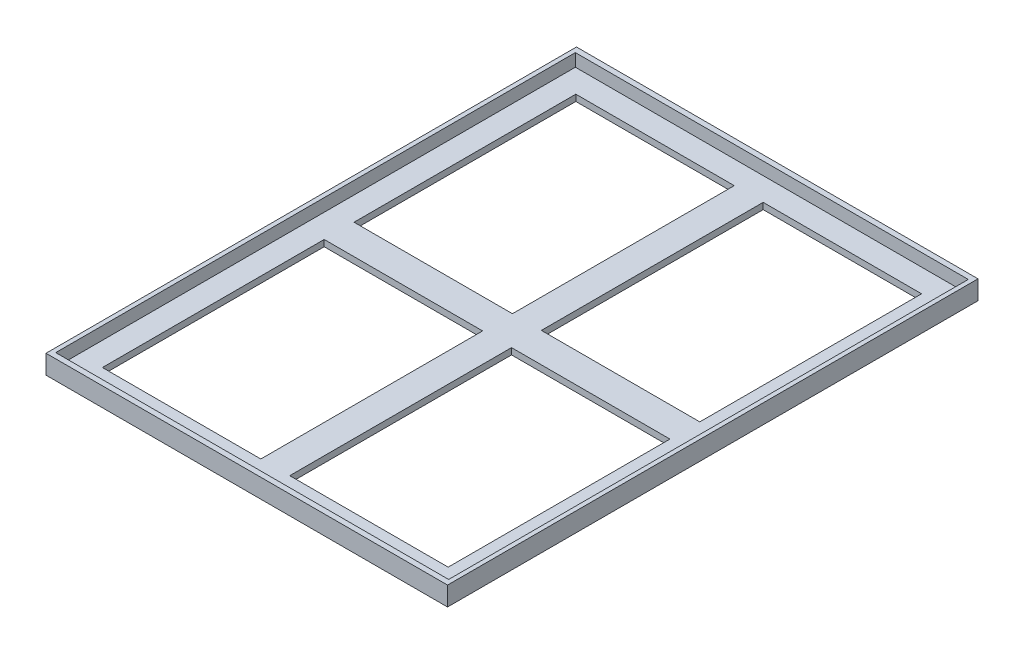
ISO-10303-21;
HEADER;
FILE_DESCRIPTION(('STEP AP214'),'2;1');
FILE_NAME('part.step','',(''),(''),'','','');
FILE_SCHEMA(('AUTOMOTIVE_DESIGN { 1 0 10303 214 1 1 1 1 }'));
ENDSEC;
DATA;
#1=APPLICATION_CONTEXT('core data for automotive mechanical design processes');
#2=APPLICATION_PROTOCOL_DEFINITION('international standard','automotive_design',2000,#1);
#3=PRODUCT_CONTEXT('',#1,'mechanical');
#4=PRODUCT('Part','Part','',(#3));
#5=PRODUCT_RELATED_PRODUCT_CATEGORY('part','',(#4));
#6=PRODUCT_DEFINITION_FORMATION('','',#4);
#7=PRODUCT_DEFINITION_CONTEXT('part definition',#1,'design');
#8=PRODUCT_DEFINITION('design','',#6,#7);
#9=PRODUCT_DEFINITION_SHAPE('','',#8);
#10=(LENGTH_UNIT() NAMED_UNIT(*) SI_UNIT(.MILLI.,.METRE.));
#11=(NAMED_UNIT(*) PLANE_ANGLE_UNIT() SI_UNIT($,.RADIAN.));
#12=(NAMED_UNIT(*) SI_UNIT($,.STERADIAN.) SOLID_ANGLE_UNIT());
#13=UNCERTAINTY_MEASURE_WITH_UNIT(LENGTH_MEASURE(1.E-05),#10,'distance_accuracy_value','');
#14=(GEOMETRIC_REPRESENTATION_CONTEXT(3) GLOBAL_UNCERTAINTY_ASSIGNED_CONTEXT((#13)) GLOBAL_UNIT_ASSIGNED_CONTEXT((#10,
#11,#12)) REPRESENTATION_CONTEXT('',''));
#15=CARTESIAN_POINT('',(0.,0.,0.));
#16=DIRECTION('',(0.,0.,1.));
#17=DIRECTION('',(1.,0.,0.));
#18=AXIS2_PLACEMENT_3D('',#15,#16,#17);
#19=CARTESIAN_POINT('',(0.,10.,0.));
#20=DIRECTION('',(0.,1.,0.));
#21=DIRECTION('',(0.,0.,1.));
#22=AXIS2_PLACEMENT_3D('',#19,#20,#21);
#23=PLANE('',#22);
#24=DIRECTION('',(0.,0.,-1.));
#25=VECTOR('',#24,1.);
#26=CARTESIAN_POINT('',(22.8124841723817,10.,-23.5379063120699));
#27=LINE('',#26,#25);
#28=CARTESIAN_POINT('',(22.8124841723817,10.,-23.5379063120699));
#29=VERTEX_POINT('',#28);
#30=CARTESIAN_POINT('',(22.8124841723817,10.,-373.53790631207));
#31=VERTEX_POINT('',#30);
#32=EDGE_CURVE('E282',#29,#31,#27,.T.);
#33=ORIENTED_EDGE('',*,*,#32,.T.);
#34=DIRECTION('',(1.,0.,0.));
#35=VECTOR('',#34,1.);
#36=CARTESIAN_POINT('',(272.812484172382,10.,-373.53790631207));
#37=LINE('',#36,#35);
#38=CARTESIAN_POINT('',(272.812484172382,10.,-373.53790631207));
#39=VERTEX_POINT('',#38);
#40=EDGE_CURVE('E294',#31,#39,#37,.T.);
#41=ORIENTED_EDGE('',*,*,#40,.T.);
#42=DIRECTION('',(0.,0.,1.));
#43=VECTOR('',#42,1.);
#44=CARTESIAN_POINT('',(272.812484172382,10.,-23.5379063120699));
#45=LINE('',#44,#43);
#46=CARTESIAN_POINT('',(272.812484172382,10.,-23.5379063120699));
#47=VERTEX_POINT('',#46);
#48=EDGE_CURVE('E291',#39,#47,#45,.T.);
#49=ORIENTED_EDGE('',*,*,#48,.T.);
#50=DIRECTION('',(-1.,0.,0.));
#51=VECTOR('',#50,1.);
#52=CARTESIAN_POINT('',(272.812484172382,10.,-23.5379063120699));
#53=LINE('',#52,#51);
#54=EDGE_CURVE('E271',#47,#29,#53,.T.);
#55=ORIENTED_EDGE('',*,*,#54,.T.);
#56=EDGE_LOOP('',(#33,#41,#49,#55));
#57=FACE_BOUND('',#56,.T.);
#58=DIRECTION('',(0.,0.,-1.));
#59=VECTOR('',#58,1.);
#60=CARTESIAN_POINT('',(-272.812484172382,10.,-23.53790631207));
#61=LINE('',#60,#59);
#62=CARTESIAN_POINT('',(-272.812484172382,10.,-23.53790631207));
#63=VERTEX_POINT('',#62);
#64=CARTESIAN_POINT('',(-272.812484172382,10.,-373.53790631207));
#65=VERTEX_POINT('',#64);
#66=EDGE_CURVE('E252',#63,#65,#61,.T.);
#67=ORIENTED_EDGE('',*,*,#66,.T.);
#68=DIRECTION('',(1.,0.,0.));
#69=VECTOR('',#68,1.);
#70=CARTESIAN_POINT('',(-22.8124841723816,10.,-373.53790631207));
#71=LINE('',#70,#69);
#72=CARTESIAN_POINT('',(-22.8124841723816,10.,-373.53790631207));
#73=VERTEX_POINT('',#72);
#74=EDGE_CURVE('E264',#65,#73,#71,.T.);
#75=ORIENTED_EDGE('',*,*,#74,.T.);
#76=DIRECTION('',(0.,0.,1.));
#77=VECTOR('',#76,1.);
#78=CARTESIAN_POINT('',(-22.8124841723817,10.,-23.53790631207));
#79=LINE('',#78,#77);
#80=CARTESIAN_POINT('',(-22.8124841723817,10.,-23.53790631207));
#81=VERTEX_POINT('',#80);
#82=EDGE_CURVE('E261',#73,#81,#79,.T.);
#83=ORIENTED_EDGE('',*,*,#82,.T.);
#84=DIRECTION('',(-1.,0.,0.));
#85=VECTOR('',#84,1.);
#86=CARTESIAN_POINT('',(-22.8124841723817,10.,-23.53790631207));
#87=LINE('',#86,#85);
#88=EDGE_CURVE('E241',#81,#63,#87,.T.);
#89=ORIENTED_EDGE('',*,*,#88,.T.);
#90=EDGE_LOOP('',(#67,#75,#83,#89));
#91=FACE_BOUND('',#90,.T.);
#92=DIRECTION('',(0.,0.,-1.));
#93=VECTOR('',#92,1.);
#94=CARTESIAN_POINT('',(-272.812484172382,10.,373.53790631207));
#95=LINE('',#94,#93);
#96=CARTESIAN_POINT('',(-272.812484172382,10.,373.53790631207));
#97=VERTEX_POINT('',#96);
#98=CARTESIAN_POINT('',(-272.812484172382,10.,23.5379063120699));
#99=VERTEX_POINT('',#98);
#100=EDGE_CURVE('E204',#97,#99,#95,.T.);
#101=ORIENTED_EDGE('',*,*,#100,.T.);
#102=DIRECTION('',(1.,0.,0.));
#103=VECTOR('',#102,1.);
#104=CARTESIAN_POINT('',(-22.8124841723817,10.,23.53790631207));
#105=LINE('',#104,#103);
#106=CARTESIAN_POINT('',(-22.8124841723817,10.,23.53790631207));
#107=VERTEX_POINT('',#106);
#108=EDGE_CURVE('E235',#99,#107,#105,.T.);
#109=ORIENTED_EDGE('',*,*,#108,.T.);
#110=DIRECTION('',(0.,0.,1.));
#111=VECTOR('',#110,1.);
#112=CARTESIAN_POINT('',(-22.8124841723817,10.,373.53790631207));
#113=LINE('',#112,#111);
#114=CARTESIAN_POINT('',(-22.8124841723817,10.,373.53790631207));
#115=VERTEX_POINT('',#114);
#116=EDGE_CURVE('E231',#107,#115,#113,.T.);
#117=ORIENTED_EDGE('',*,*,#116,.T.);
#118=DIRECTION('',(-1.,0.,0.));
#119=VECTOR('',#118,1.);
#120=CARTESIAN_POINT('',(-22.8124841723817,10.,373.53790631207));
#121=LINE('',#120,#119);
#122=EDGE_CURVE('E229',#115,#97,#121,.T.);
#123=ORIENTED_EDGE('',*,*,#122,.T.);
#124=EDGE_LOOP('',(#101,#109,#117,#123));
#125=FACE_BOUND('',#124,.T.);
#126=DIRECTION('',(0.,0.,-1.));
#127=VECTOR('',#126,1.);
#128=CARTESIAN_POINT('',(310.,10.,-410.));
#129=LINE('',#128,#127);
#130=CARTESIAN_POINT('',(310.,10.,410.));
#131=VERTEX_POINT('',#130);
#132=CARTESIAN_POINT('',(310.,10.,-410.));
#133=VERTEX_POINT('',#132);
#134=EDGE_CURVE('E322',#131,#133,#129,.T.);
#135=ORIENTED_EDGE('',*,*,#134,.T.);
#136=DIRECTION('',(-1.,0.,0.));
#137=VECTOR('',#136,1.);
#138=CARTESIAN_POINT('',(-310.,10.,-410.));
#139=LINE('',#138,#137);
#140=CARTESIAN_POINT('',(-310.,10.,-410.));
#141=VERTEX_POINT('',#140);
#142=EDGE_CURVE('E341',#133,#141,#139,.T.);
#143=ORIENTED_EDGE('',*,*,#142,.T.);
#144=DIRECTION('',(0.,0.,1.));
#145=VECTOR('',#144,1.);
#146=CARTESIAN_POINT('',(-310.,10.,-410.));
#147=LINE('',#146,#145);
#148=CARTESIAN_POINT('',(-310.,10.,410.));
#149=VERTEX_POINT('',#148);
#150=EDGE_CURVE('E343',#141,#149,#147,.T.);
#151=ORIENTED_EDGE('',*,*,#150,.T.);
#152=DIRECTION('',(1.,0.,0.));
#153=VECTOR('',#152,1.);
#154=CARTESIAN_POINT('',(-310.,10.,410.));
#155=LINE('',#154,#153);
#156=EDGE_CURVE('E332',#149,#131,#155,.T.);
#157=ORIENTED_EDGE('',*,*,#156,.T.);
#158=EDGE_LOOP('',(#135,#143,#151,#157));
#159=FACE_BOUND('',#158,.T.);
#160=DIRECTION('',(-1.,0.,0.));
#161=VECTOR('',#160,1.);
#162=CARTESIAN_POINT('',(272.812484172382,10.,373.53790631207));
#163=LINE('',#162,#161);
#164=CARTESIAN_POINT('',(272.812484172382,10.,373.53790631207));
#165=VERTEX_POINT('',#164);
#166=CARTESIAN_POINT('',(22.8124841723817,10.,373.53790631207));
#167=VERTEX_POINT('',#166);
#168=EDGE_CURVE('E309',#165,#167,#163,.T.);
#169=ORIENTED_EDGE('',*,*,#168,.T.);
#170=DIRECTION('',(0.,0.,-1.));
#171=VECTOR('',#170,1.);
#172=CARTESIAN_POINT('',(22.8124841723817,10.,373.53790631207));
#173=LINE('',#172,#171);
#174=CARTESIAN_POINT('',(22.8124841723817,10.,23.53790631207));
#175=VERTEX_POINT('',#174);
#176=EDGE_CURVE('E299',#167,#175,#173,.T.);
#177=ORIENTED_EDGE('',*,*,#176,.T.);
#178=DIRECTION('',(1.,0.,0.));
#179=VECTOR('',#178,1.);
#180=CARTESIAN_POINT('',(272.812484172382,10.,23.53790631207));
#181=LINE('',#180,#179);
#182=CARTESIAN_POINT('',(272.812484172382,10.,23.53790631207));
#183=VERTEX_POINT('',#182);
#184=EDGE_CURVE('E302',#175,#183,#181,.T.);
#185=ORIENTED_EDGE('',*,*,#184,.T.);
#186=DIRECTION('',(0.,0.,1.));
#187=VECTOR('',#186,1.);
#188=CARTESIAN_POINT('',(272.812484172382,10.,373.53790631207));
#189=LINE('',#188,#187);
#190=EDGE_CURVE('E306',#183,#165,#189,.T.);
#191=ORIENTED_EDGE('',*,*,#190,.T.);
#192=EDGE_LOOP('',(#169,#177,#185,#191));
#193=FACE_BOUND('',#192,.T.);
#194=ADVANCED_FACE('F38',(#57,#91,#125,#159,#193),#23,.T.);
#195=CARTESIAN_POINT('',(316.812484172382,0.,418.53790631207));
#196=DIRECTION('',(-1.,0.,0.));
#197=DIRECTION('',(0.,0.,1.));
#198=AXIS2_PLACEMENT_3D('',#195,#196,#197);
#199=PLANE('',#198);
#200=DIRECTION('',(0.,1.,0.));
#201=VECTOR('',#200,1.);
#202=CARTESIAN_POINT('',(316.812484172382,0.,-418.53790631207));
#203=LINE('',#202,#201);
#204=CARTESIAN_POINT('',(316.812484172382,0.,-418.53790631207));
#205=VERTEX_POINT('',#204);
#206=CARTESIAN_POINT('',(316.812484172382,30.,-418.53790631207));
#207=VERTEX_POINT('',#206);
#208=EDGE_CURVE('E378',#205,#207,#203,.T.);
#209=ORIENTED_EDGE('',*,*,#208,.T.);
#210=DIRECTION('',(0.,0.,-1.));
#211=VECTOR('',#210,1.);
#212=CARTESIAN_POINT('',(316.812484172382,30.,-418.53790631207));
#213=LINE('',#212,#211);
#214=CARTESIAN_POINT('',(316.812484172382,30.,418.53790631207));
#215=VERTEX_POINT('',#214);
#216=EDGE_CURVE('E357',#215,#207,#213,.T.);
#217=ORIENTED_EDGE('',*,*,#216,.F.);
#218=DIRECTION('',(0.,1.,0.));
#219=VECTOR('',#218,1.);
#220=CARTESIAN_POINT('',(316.812484172382,0.,418.53790631207));
#221=LINE('',#220,#219);
#222=CARTESIAN_POINT('',(316.812484172382,0.,418.53790631207));
#223=VERTEX_POINT('',#222);
#224=EDGE_CURVE('E11',#223,#215,#221,.T.);
#225=ORIENTED_EDGE('',*,*,#224,.F.);
#226=DIRECTION('',(0.,0.,1.));
#227=VECTOR('',#226,1.);
#228=CARTESIAN_POINT('',(316.812484172382,0.,418.53790631207));
#229=LINE('',#228,#227);
#230=EDGE_CURVE('E369',#205,#223,#229,.T.);
#231=ORIENTED_EDGE('',*,*,#230,.F.);
#232=EDGE_LOOP('',(#209,#217,#225,#231));
#233=FACE_BOUND('',#232,.T.);
#234=ADVANCED_FACE('F398',(#233),#199,.F.);
#235=CARTESIAN_POINT('',(-316.812484172382,0.,418.53790631207));
#236=DIRECTION('',(0.,0.,-1.));
#237=DIRECTION('',(-1.,0.,0.));
#238=AXIS2_PLACEMENT_3D('',#235,#236,#237);
#239=PLANE('',#238);
#240=ORIENTED_EDGE('',*,*,#224,.T.);
#241=DIRECTION('',(1.,0.,0.));
#242=VECTOR('',#241,1.);
#243=CARTESIAN_POINT('',(-316.812484172382,30.,418.53790631207));
#244=LINE('',#243,#242);
#245=CARTESIAN_POINT('',(-316.812484172382,30.,418.53790631207));
#246=VERTEX_POINT('',#245);
#247=EDGE_CURVE('E366',#246,#215,#244,.T.);
#248=ORIENTED_EDGE('',*,*,#247,.F.);
#249=DIRECTION('',(0.,1.,0.));
#250=VECTOR('',#249,1.);
#251=CARTESIAN_POINT('',(-316.812484172382,0.,418.53790631207));
#252=LINE('',#251,#250);
#253=CARTESIAN_POINT('',(-316.812484172382,0.,418.53790631207));
#254=VERTEX_POINT('',#253);
#255=EDGE_CURVE('E46',#254,#246,#252,.T.);
#256=ORIENTED_EDGE('',*,*,#255,.F.);
#257=DIRECTION('',(-1.,0.,0.));
#258=VECTOR('',#257,1.);
#259=CARTESIAN_POINT('',(-316.812484172382,0.,418.53790631207));
#260=LINE('',#259,#258);
#261=EDGE_CURVE('E372',#223,#254,#260,.T.);
#262=ORIENTED_EDGE('',*,*,#261,.F.);
#263=EDGE_LOOP('',(#240,#248,#256,#262));
#264=FACE_BOUND('',#263,.T.);
#265=ADVANCED_FACE('F394',(#264),#239,.F.);
#266=CARTESIAN_POINT('',(-316.812484172382,0.,418.53790631207));
#267=DIRECTION('',(1.,0.,0.));
#268=DIRECTION('',(0.,0.,-1.));
#269=AXIS2_PLACEMENT_3D('',#266,#267,#268);
#270=PLANE('',#269);
#271=ORIENTED_EDGE('',*,*,#255,.T.);
#272=DIRECTION('',(0.,0.,1.));
#273=VECTOR('',#272,1.);
#274=CARTESIAN_POINT('',(-316.812484172382,30.,-418.53790631207));
#275=LINE('',#274,#273);
#276=CARTESIAN_POINT('',(-316.812484172382,30.,-418.53790631207));
#277=VERTEX_POINT('',#276);
#278=EDGE_CURVE('E363',#277,#246,#275,.T.);
#279=ORIENTED_EDGE('',*,*,#278,.F.);
#280=DIRECTION('',(0.,1.,0.));
#281=VECTOR('',#280,1.);
#282=CARTESIAN_POINT('',(-316.812484172382,0.,-418.53790631207));
#283=LINE('',#282,#281);
#284=CARTESIAN_POINT('',(-316.812484172382,0.,-418.53790631207));
#285=VERTEX_POINT('',#284);
#286=EDGE_CURVE('E380',#285,#277,#283,.T.);
#287=ORIENTED_EDGE('',*,*,#286,.F.);
#288=DIRECTION('',(0.,0.,-1.));
#289=VECTOR('',#288,1.);
#290=CARTESIAN_POINT('',(-316.812484172382,0.,418.53790631207));
#291=LINE('',#290,#289);
#292=EDGE_CURVE('E374',#254,#285,#291,.T.);
#293=ORIENTED_EDGE('',*,*,#292,.F.);
#294=EDGE_LOOP('',(#271,#279,#287,#293));
#295=FACE_BOUND('',#294,.T.);
#296=ADVANCED_FACE('F385',(#295),#270,.F.);
#297=CARTESIAN_POINT('',(-316.812484172382,0.,-418.53790631207));
#298=DIRECTION('',(0.,0.,1.));
#299=DIRECTION('',(1.,0.,0.));
#300=AXIS2_PLACEMENT_3D('',#297,#298,#299);
#301=PLANE('',#300);
#302=ORIENTED_EDGE('',*,*,#286,.T.);
#303=DIRECTION('',(-1.,0.,0.));
#304=VECTOR('',#303,1.);
#305=CARTESIAN_POINT('',(-316.812484172382,30.,-418.53790631207));
#306=LINE('',#305,#304);
#307=EDGE_CURVE('E360',#207,#277,#306,.T.);
#308=ORIENTED_EDGE('',*,*,#307,.F.);
#309=ORIENTED_EDGE('',*,*,#208,.F.);
#310=DIRECTION('',(1.,0.,0.));
#311=VECTOR('',#310,1.);
#312=CARTESIAN_POINT('',(-316.812484172382,0.,-418.53790631207));
#313=LINE('',#312,#311);
#314=EDGE_CURVE('E376',#285,#205,#313,.T.);
#315=ORIENTED_EDGE('',*,*,#314,.F.);
#316=EDGE_LOOP('',(#302,#308,#309,#315));
#317=FACE_BOUND('',#316,.T.);
#318=ADVANCED_FACE('F402',(#317),#301,.F.);
#319=CARTESIAN_POINT('',(0.,0.,0.));
#320=DIRECTION('',(0.,1.,0.));
#321=DIRECTION('',(0.,0.,1.));
#322=AXIS2_PLACEMENT_3D('',#319,#320,#321);
#323=PLANE('',#322);
#324=DIRECTION('',(1.,0.,0.));
#325=VECTOR('',#324,1.);
#326=CARTESIAN_POINT('',(272.812484172382,0.,-373.53790631207));
#327=LINE('',#326,#325);
#328=CARTESIAN_POINT('',(22.8124841723817,0.,-373.53790631207));
#329=VERTEX_POINT('',#328);
#330=CARTESIAN_POINT('',(272.812484172382,0.,-373.53790631207));
#331=VERTEX_POINT('',#330);
#332=EDGE_CURVE('E285',#329,#331,#327,.T.);
#333=ORIENTED_EDGE('',*,*,#332,.F.);
#334=DIRECTION('',(0.,0.,-1.));
#335=VECTOR('',#334,1.);
#336=CARTESIAN_POINT('',(22.8124841723817,0.,-23.5379063120699));
#337=LINE('',#336,#335);
#338=CARTESIAN_POINT('',(22.8124841723817,0.,-23.5379063120699));
#339=VERTEX_POINT('',#338);
#340=EDGE_CURVE('E53',#339,#329,#337,.T.);
#341=ORIENTED_EDGE('',*,*,#340,.F.);
#342=DIRECTION('',(-1.,0.,0.));
#343=VECTOR('',#342,1.);
#344=CARTESIAN_POINT('',(272.812484172382,0.,-23.5379063120699));
#345=LINE('',#344,#343);
#346=CARTESIAN_POINT('',(272.812484172382,0.,-23.5379063120699));
#347=VERTEX_POINT('',#346);
#348=EDGE_CURVE('E278',#347,#339,#345,.T.);
#349=ORIENTED_EDGE('',*,*,#348,.F.);
#350=DIRECTION('',(0.,0.,1.));
#351=VECTOR('',#350,1.);
#352=CARTESIAN_POINT('',(272.812484172382,0.,-23.5379063120699));
#353=LINE('',#352,#351);
#354=EDGE_CURVE('E281',#331,#347,#353,.T.);
#355=ORIENTED_EDGE('',*,*,#354,.F.);
#356=EDGE_LOOP('',(#333,#341,#349,#355));
#357=FACE_BOUND('',#356,.T.);
#358=DIRECTION('',(1.,0.,0.));
#359=VECTOR('',#358,1.);
#360=CARTESIAN_POINT('',(-22.8124841723816,0.,-373.53790631207));
#361=LINE('',#360,#359);
#362=CARTESIAN_POINT('',(-272.812484172382,0.,-373.53790631207));
#363=VERTEX_POINT('',#362);
#364=CARTESIAN_POINT('',(-22.8124841723816,0.,-373.53790631207));
#365=VERTEX_POINT('',#364);
#366=EDGE_CURVE('E255',#363,#365,#361,.T.);
#367=ORIENTED_EDGE('',*,*,#366,.F.);
#368=DIRECTION('',(0.,0.,-1.));
#369=VECTOR('',#368,1.);
#370=CARTESIAN_POINT('',(-272.812484172382,0.,-23.53790631207));
#371=LINE('',#370,#369);
#372=CARTESIAN_POINT('',(-272.812484172382,0.,-23.53790631207));
#373=VERTEX_POINT('',#372);
#374=EDGE_CURVE('E61',#373,#363,#371,.T.);
#375=ORIENTED_EDGE('',*,*,#374,.F.);
#376=DIRECTION('',(-1.,0.,0.));
#377=VECTOR('',#376,1.);
#378=CARTESIAN_POINT('',(-22.8124841723817,0.,-23.53790631207));
#379=LINE('',#378,#377);
#380=CARTESIAN_POINT('',(-22.8124841723817,0.,-23.53790631207));
#381=VERTEX_POINT('',#380);
#382=EDGE_CURVE('E248',#381,#373,#379,.T.);
#383=ORIENTED_EDGE('',*,*,#382,.F.);
#384=DIRECTION('',(0.,0.,1.));
#385=VECTOR('',#384,1.);
#386=CARTESIAN_POINT('',(-22.8124841723817,0.,-23.53790631207));
#387=LINE('',#386,#385);
#388=EDGE_CURVE('E251',#365,#381,#387,.T.);
#389=ORIENTED_EDGE('',*,*,#388,.F.);
#390=EDGE_LOOP('',(#367,#375,#383,#389));
#391=FACE_BOUND('',#390,.T.);
#392=DIRECTION('',(1.,0.,0.));
#393=VECTOR('',#392,1.);
#394=CARTESIAN_POINT('',(-22.8124841723817,0.,23.53790631207));
#395=LINE('',#394,#393);
#396=CARTESIAN_POINT('',(-272.812484172382,0.,23.5379063120699));
#397=VERTEX_POINT('',#396);
#398=CARTESIAN_POINT('',(-22.8124841723817,0.,23.53790631207));
#399=VERTEX_POINT('',#398);
#400=EDGE_CURVE('E221',#397,#399,#395,.T.);
#401=ORIENTED_EDGE('',*,*,#400,.F.);
#402=DIRECTION('',(0.,0.,-1.));
#403=VECTOR('',#402,1.);
#404=CARTESIAN_POINT('',(-272.812484172382,0.,373.53790631207));
#405=LINE('',#404,#403);
#406=CARTESIAN_POINT('',(-272.812484172382,0.,373.53790631207));
#407=VERTEX_POINT('',#406);
#408=EDGE_CURVE('E201',#407,#397,#405,.T.);
#409=ORIENTED_EDGE('',*,*,#408,.F.);
#410=DIRECTION('',(-1.,0.,0.));
#411=VECTOR('',#410,1.);
#412=CARTESIAN_POINT('',(-22.8124841723817,0.,373.53790631207));
#413=LINE('',#412,#411);
#414=CARTESIAN_POINT('',(-22.8124841723817,0.,373.53790631207));
#415=VERTEX_POINT('',#414);
#416=EDGE_CURVE('E211',#415,#407,#413,.T.);
#417=ORIENTED_EDGE('',*,*,#416,.F.);
#418=DIRECTION('',(0.,0.,1.));
#419=VECTOR('',#418,1.);
#420=CARTESIAN_POINT('',(-22.8124841723817,0.,373.53790631207));
#421=LINE('',#420,#419);
#422=EDGE_CURVE('E216',#399,#415,#421,.T.);
#423=ORIENTED_EDGE('',*,*,#422,.F.);
#424=EDGE_LOOP('',(#401,#409,#417,#423));
#425=FACE_BOUND('',#424,.T.);
#426=DIRECTION('',(1.,0.,0.));
#427=VECTOR('',#426,1.);
#428=CARTESIAN_POINT('',(272.812484172382,0.,23.53790631207));
#429=LINE('',#428,#427);
#430=CARTESIAN_POINT('',(22.8124841723817,0.,23.53790631207));
#431=VERTEX_POINT('',#430);
#432=CARTESIAN_POINT('',(272.812484172382,0.,23.53790631207));
#433=VERTEX_POINT('',#432);
#434=EDGE_CURVE('E224',#431,#433,#429,.T.);
#435=ORIENTED_EDGE('',*,*,#434,.F.);
#436=DIRECTION('',(0.,0.,-1.));
#437=VECTOR('',#436,1.);
#438=CARTESIAN_POINT('',(22.8124841723817,0.,373.53790631207));
#439=LINE('',#438,#437);
#440=CARTESIAN_POINT('',(22.8124841723817,0.,373.53790631207));
#441=VERTEX_POINT('',#440);
#442=EDGE_CURVE('E222',#441,#431,#439,.T.);
#443=ORIENTED_EDGE('',*,*,#442,.F.);
#444=DIRECTION('',(-1.,0.,0.));
#445=VECTOR('',#444,1.);
#446=CARTESIAN_POINT('',(272.812484172382,0.,373.53790631207));
#447=LINE('',#446,#445);
#448=CARTESIAN_POINT('',(272.812484172382,0.,373.53790631207));
#449=VERTEX_POINT('',#448);
#450=EDGE_CURVE('E303',#449,#441,#447,.T.);
#451=ORIENTED_EDGE('',*,*,#450,.F.);
#452=DIRECTION('',(0.,0.,1.));
#453=VECTOR('',#452,1.);
#454=CARTESIAN_POINT('',(272.812484172382,0.,373.53790631207));
#455=LINE('',#454,#453);
#456=EDGE_CURVE('E315',#433,#449,#455,.T.);
#457=ORIENTED_EDGE('',*,*,#456,.F.);
#458=EDGE_LOOP('',(#435,#443,#451,#457));
#459=FACE_BOUND('',#458,.T.);
#460=ORIENTED_EDGE('',*,*,#230,.T.);
#461=ORIENTED_EDGE('',*,*,#261,.T.);
#462=ORIENTED_EDGE('',*,*,#292,.T.);
#463=ORIENTED_EDGE('',*,*,#314,.T.);
#464=EDGE_LOOP('',(#460,#461,#462,#463));
#465=FACE_BOUND('',#464,.T.);
#466=ADVANCED_FACE('F40',(#357,#391,#425,#459,#465),#323,.F.);
#467=CARTESIAN_POINT('',(0.,30.,0.));
#468=DIRECTION('',(0.,1.,0.));
#469=DIRECTION('',(0.,0.,1.));
#470=AXIS2_PLACEMENT_3D('',#467,#468,#469);
#471=PLANE('',#470);
#472=ORIENTED_EDGE('',*,*,#216,.T.);
#473=ORIENTED_EDGE('',*,*,#307,.T.);
#474=ORIENTED_EDGE('',*,*,#278,.T.);
#475=ORIENTED_EDGE('',*,*,#247,.T.);
#476=EDGE_LOOP('',(#472,#473,#474,#475));
#477=FACE_BOUND('',#476,.T.);
#478=DIRECTION('',(-1.,0.,0.));
#479=VECTOR('',#478,1.);
#480=CARTESIAN_POINT('',(-310.,30.,-410.));
#481=LINE('',#480,#479);
#482=CARTESIAN_POINT('',(310.,30.,-410.));
#483=VERTEX_POINT('',#482);
#484=CARTESIAN_POINT('',(-310.,30.,-410.));
#485=VERTEX_POINT('',#484);
#486=EDGE_CURVE('E331',#483,#485,#481,.T.);
#487=ORIENTED_EDGE('',*,*,#486,.F.);
#488=DIRECTION('',(0.,0.,-1.));
#489=VECTOR('',#488,1.);
#490=CARTESIAN_POINT('',(310.,30.,-410.));
#491=LINE('',#490,#489);
#492=CARTESIAN_POINT('',(310.,30.,410.));
#493=VERTEX_POINT('',#492);
#494=EDGE_CURVE('E329',#493,#483,#491,.T.);
#495=ORIENTED_EDGE('',*,*,#494,.F.);
#496=DIRECTION('',(1.,0.,0.));
#497=VECTOR('',#496,1.);
#498=CARTESIAN_POINT('',(-310.,30.,410.));
#499=LINE('',#498,#497);
#500=CARTESIAN_POINT('',(-310.,30.,410.));
#501=VERTEX_POINT('',#500);
#502=EDGE_CURVE('E337',#501,#493,#499,.T.);
#503=ORIENTED_EDGE('',*,*,#502,.F.);
#504=DIRECTION('',(0.,0.,1.));
#505=VECTOR('',#504,1.);
#506=CARTESIAN_POINT('',(-310.,30.,-410.));
#507=LINE('',#506,#505);
#508=EDGE_CURVE('E334',#485,#501,#507,.T.);
#509=ORIENTED_EDGE('',*,*,#508,.F.);
#510=EDGE_LOOP('',(#487,#495,#503,#509));
#511=FACE_BOUND('',#510,.T.);
#512=ADVANCED_FACE('F390',(#477,#511),#471,.T.);
#513=CARTESIAN_POINT('',(310.,30.,-410.));
#514=DIRECTION('',(-1.,0.,0.));
#515=DIRECTION('',(0.,0.,1.));
#516=AXIS2_PLACEMENT_3D('',#513,#514,#515);
#517=PLANE('',#516);
#518=ORIENTED_EDGE('',*,*,#134,.F.);
#519=DIRECTION('',(0.,-1.,0.));
#520=VECTOR('',#519,1.);
#521=CARTESIAN_POINT('',(310.,30.,410.));
#522=LINE('',#521,#520);
#523=EDGE_CURVE('E339',#493,#131,#522,.T.);
#524=ORIENTED_EDGE('',*,*,#523,.F.);
#525=ORIENTED_EDGE('',*,*,#494,.T.);
#526=DIRECTION('',(0.,-1.,0.));
#527=VECTOR('',#526,1.);
#528=CARTESIAN_POINT('',(310.,30.,-410.));
#529=LINE('',#528,#527);
#530=EDGE_CURVE('E354',#483,#133,#529,.T.);
#531=ORIENTED_EDGE('',*,*,#530,.T.);
#532=EDGE_LOOP('',(#518,#524,#525,#531));
#533=FACE_BOUND('',#532,.T.);
#534=ADVANCED_FACE('F411',(#533),#517,.T.);
#535=CARTESIAN_POINT('',(-310.,30.,-410.));
#536=DIRECTION('',(0.,0.,1.));
#537=DIRECTION('',(1.,0.,0.));
#538=AXIS2_PLACEMENT_3D('',#535,#536,#537);
#539=PLANE('',#538);
#540=ORIENTED_EDGE('',*,*,#142,.F.);
#541=ORIENTED_EDGE('',*,*,#530,.F.);
#542=ORIENTED_EDGE('',*,*,#486,.T.);
#543=DIRECTION('',(0.,-1.,0.));
#544=VECTOR('',#543,1.);
#545=CARTESIAN_POINT('',(-310.,30.,-410.));
#546=LINE('',#545,#544);
#547=EDGE_CURVE('E351',#485,#141,#546,.T.);
#548=ORIENTED_EDGE('',*,*,#547,.T.);
#549=EDGE_LOOP('',(#540,#541,#542,#548));
#550=FACE_BOUND('',#549,.T.);
#551=ADVANCED_FACE('F431',(#550),#539,.T.);
#552=CARTESIAN_POINT('',(-310.,30.,-410.));
#553=DIRECTION('',(1.,0.,0.));
#554=DIRECTION('',(0.,0.,-1.));
#555=AXIS2_PLACEMENT_3D('',#552,#553,#554);
#556=PLANE('',#555);
#557=ORIENTED_EDGE('',*,*,#150,.F.);
#558=ORIENTED_EDGE('',*,*,#547,.F.);
#559=ORIENTED_EDGE('',*,*,#508,.T.);
#560=DIRECTION('',(0.,-1.,0.));
#561=VECTOR('',#560,1.);
#562=CARTESIAN_POINT('',(-310.,30.,410.));
#563=LINE('',#562,#561);
#564=EDGE_CURVE('E348',#501,#149,#563,.T.);
#565=ORIENTED_EDGE('',*,*,#564,.T.);
#566=EDGE_LOOP('',(#557,#558,#559,#565));
#567=FACE_BOUND('',#566,.T.);
#568=ADVANCED_FACE('F435',(#567),#556,.T.);
#569=CARTESIAN_POINT('',(-310.,30.,410.));
#570=DIRECTION('',(0.,0.,-1.));
#571=DIRECTION('',(-1.,0.,0.));
#572=AXIS2_PLACEMENT_3D('',#569,#570,#571);
#573=PLANE('',#572);
#574=ORIENTED_EDGE('',*,*,#156,.F.);
#575=ORIENTED_EDGE('',*,*,#564,.F.);
#576=ORIENTED_EDGE('',*,*,#502,.T.);
#577=ORIENTED_EDGE('',*,*,#523,.T.);
#578=EDGE_LOOP('',(#574,#575,#576,#577));
#579=FACE_BOUND('',#578,.T.);
#580=ADVANCED_FACE('F439',(#579),#573,.T.);
#581=CARTESIAN_POINT('',(-272.812484172382,10.,373.53790631207));
#582=DIRECTION('',(-1.,0.,0.));
#583=DIRECTION('',(0.,0.,1.));
#584=AXIS2_PLACEMENT_3D('',#581,#582,#583);
#585=PLANE('',#584);
#586=ORIENTED_EDGE('',*,*,#408,.T.);
#587=DIRECTION('',(0.,-1.,0.));
#588=VECTOR('',#587,1.);
#589=CARTESIAN_POINT('',(-272.812484172382,10.,23.5379063120699));
#590=LINE('',#589,#588);
#591=EDGE_CURVE('E232',#99,#397,#590,.T.);
#592=ORIENTED_EDGE('',*,*,#591,.F.);
#593=ORIENTED_EDGE('',*,*,#100,.F.);
#594=DIRECTION('',(0.,-1.,0.));
#595=VECTOR('',#594,1.);
#596=CARTESIAN_POINT('',(-272.812484172382,10.,373.53790631207));
#597=LINE('',#596,#595);
#598=EDGE_CURVE('E197',#97,#407,#597,.T.);
#599=ORIENTED_EDGE('',*,*,#598,.T.);
#600=EDGE_LOOP('',(#586,#592,#593,#599));
#601=FACE_BOUND('',#600,.T.);
#602=ADVANCED_FACE('F199',(#601),#585,.F.);
#603=CARTESIAN_POINT('',(-22.8124841723817,10.,373.53790631207));
#604=DIRECTION('',(0.,0.,1.));
#605=DIRECTION('',(1.,0.,0.));
#606=AXIS2_PLACEMENT_3D('',#603,#604,#605);
#607=PLANE('',#606);
#608=ORIENTED_EDGE('',*,*,#416,.T.);
#609=ORIENTED_EDGE('',*,*,#598,.F.);
#610=ORIENTED_EDGE('',*,*,#122,.F.);
#611=DIRECTION('',(0.,-1.,0.));
#612=VECTOR('',#611,1.);
#613=CARTESIAN_POINT('',(-22.8124841723817,10.,373.53790631207));
#614=LINE('',#613,#612);
#615=EDGE_CURVE('E208',#115,#415,#614,.T.);
#616=ORIENTED_EDGE('',*,*,#615,.T.);
#617=EDGE_LOOP('',(#608,#609,#610,#616));
#618=FACE_BOUND('',#617,.T.);
#619=ADVANCED_FACE('F212',(#618),#607,.F.);
#620=CARTESIAN_POINT('',(-22.8124841723817,10.,373.53790631207));
#621=DIRECTION('',(1.,0.,0.));
#622=DIRECTION('',(0.,0.,-1.));
#623=AXIS2_PLACEMENT_3D('',#620,#621,#622);
#624=PLANE('',#623);
#625=ORIENTED_EDGE('',*,*,#422,.T.);
#626=ORIENTED_EDGE('',*,*,#615,.F.);
#627=ORIENTED_EDGE('',*,*,#116,.F.);
#628=DIRECTION('',(0.,-1.,0.));
#629=VECTOR('',#628,1.);
#630=CARTESIAN_POINT('',(-22.8124841723817,10.,23.53790631207));
#631=LINE('',#630,#629);
#632=EDGE_CURVE('E677',#107,#399,#631,.T.);
#633=ORIENTED_EDGE('',*,*,#632,.T.);
#634=EDGE_LOOP('',(#625,#626,#627,#633));
#635=FACE_BOUND('',#634,.T.);
#636=ADVANCED_FACE('F492',(#635),#624,.F.);
#637=CARTESIAN_POINT('',(-22.8124841723817,10.,23.53790631207));
#638=DIRECTION('',(0.,0.,-1.));
#639=DIRECTION('',(-1.,0.,0.));
#640=AXIS2_PLACEMENT_3D('',#637,#638,#639);
#641=PLANE('',#640);
#642=ORIENTED_EDGE('',*,*,#400,.T.);
#643=ORIENTED_EDGE('',*,*,#632,.F.);
#644=ORIENTED_EDGE('',*,*,#108,.F.);
#645=ORIENTED_EDGE('',*,*,#591,.T.);
#646=EDGE_LOOP('',(#642,#643,#644,#645));
#647=FACE_BOUND('',#646,.T.);
#648=ADVANCED_FACE('F489',(#647),#641,.F.);
#649=CARTESIAN_POINT('',(-272.812484172382,10.,-23.53790631207));
#650=DIRECTION('',(-1.,0.,0.));
#651=DIRECTION('',(0.,0.,1.));
#652=AXIS2_PLACEMENT_3D('',#649,#650,#651);
#653=PLANE('',#652);
#654=ORIENTED_EDGE('',*,*,#374,.T.);
#655=DIRECTION('',(0.,-1.,0.));
#656=VECTOR('',#655,1.);
#657=CARTESIAN_POINT('',(-272.812484172382,10.,-373.53790631207));
#658=LINE('',#657,#656);
#659=EDGE_CURVE('E239',#65,#363,#658,.T.);
#660=ORIENTED_EDGE('',*,*,#659,.F.);
#661=ORIENTED_EDGE('',*,*,#66,.F.);
#662=DIRECTION('',(0.,-1.,0.));
#663=VECTOR('',#662,1.);
#664=CARTESIAN_POINT('',(-272.812484172382,10.,-23.53790631207));
#665=LINE('',#664,#663);
#666=EDGE_CURVE('E246',#63,#373,#665,.T.);
#667=ORIENTED_EDGE('',*,*,#666,.T.);
#668=EDGE_LOOP('',(#654,#660,#661,#667));
#669=FACE_BOUND('',#668,.T.);
#670=ADVANCED_FACE('F479',(#669),#653,.F.);
#671=CARTESIAN_POINT('',(-22.8124841723817,10.,-23.53790631207));
#672=DIRECTION('',(0.,0.,1.));
#673=DIRECTION('',(1.,0.,0.));
#674=AXIS2_PLACEMENT_3D('',#671,#672,#673);
#675=PLANE('',#674);
#676=ORIENTED_EDGE('',*,*,#382,.T.);
#677=ORIENTED_EDGE('',*,*,#666,.F.);
#678=ORIENTED_EDGE('',*,*,#88,.F.);
#679=DIRECTION('',(0.,-1.,0.));
#680=VECTOR('',#679,1.);
#681=CARTESIAN_POINT('',(-22.8124841723817,10.,-23.53790631207));
#682=LINE('',#681,#680);
#683=EDGE_CURVE('E244',#81,#381,#682,.T.);
#684=ORIENTED_EDGE('',*,*,#683,.T.);
#685=EDGE_LOOP('',(#676,#677,#678,#684));
#686=FACE_BOUND('',#685,.T.);
#687=ADVANCED_FACE('F475',(#686),#675,.F.);
#688=CARTESIAN_POINT('',(-22.8124841723817,10.,-23.53790631207));
#689=DIRECTION('',(1.,0.,0.));
#690=DIRECTION('',(0.,0.,-1.));
#691=AXIS2_PLACEMENT_3D('',#688,#689,#690);
#692=PLANE('',#691);
#693=ORIENTED_EDGE('',*,*,#388,.T.);
#694=ORIENTED_EDGE('',*,*,#683,.F.);
#695=ORIENTED_EDGE('',*,*,#82,.F.);
#696=DIRECTION('',(0.,-1.,0.));
#697=VECTOR('',#696,1.);
#698=CARTESIAN_POINT('',(-22.8124841723816,10.,-373.53790631207));
#699=LINE('',#698,#697);
#700=EDGE_CURVE('E242',#73,#365,#699,.T.);
#701=ORIENTED_EDGE('',*,*,#700,.T.);
#702=EDGE_LOOP('',(#693,#694,#695,#701));
#703=FACE_BOUND('',#702,.T.);
#704=ADVANCED_FACE('F478',(#703),#692,.F.);
#705=CARTESIAN_POINT('',(-22.8124841723816,10.,-373.53790631207));
#706=DIRECTION('',(0.,0.,-1.));
#707=DIRECTION('',(-1.,0.,0.));
#708=AXIS2_PLACEMENT_3D('',#705,#706,#707);
#709=PLANE('',#708);
#710=ORIENTED_EDGE('',*,*,#366,.T.);
#711=ORIENTED_EDGE('',*,*,#700,.F.);
#712=ORIENTED_EDGE('',*,*,#74,.F.);
#713=ORIENTED_EDGE('',*,*,#659,.T.);
#714=EDGE_LOOP('',(#710,#711,#712,#713));
#715=FACE_BOUND('',#714,.T.);
#716=ADVANCED_FACE('F474',(#715),#709,.F.);
#717=CARTESIAN_POINT('',(22.8124841723817,10.,-23.5379063120699));
#718=DIRECTION('',(-1.,0.,0.));
#719=DIRECTION('',(0.,0.,1.));
#720=AXIS2_PLACEMENT_3D('',#717,#718,#719);
#721=PLANE('',#720);
#722=ORIENTED_EDGE('',*,*,#340,.T.);
#723=DIRECTION('',(0.,-1.,0.));
#724=VECTOR('',#723,1.);
#725=CARTESIAN_POINT('',(22.8124841723817,10.,-373.53790631207));
#726=LINE('',#725,#724);
#727=EDGE_CURVE('E269',#31,#329,#726,.T.);
#728=ORIENTED_EDGE('',*,*,#727,.F.);
#729=ORIENTED_EDGE('',*,*,#32,.F.);
#730=DIRECTION('',(0.,-1.,0.));
#731=VECTOR('',#730,1.);
#732=CARTESIAN_POINT('',(22.8124841723817,10.,-23.5379063120699));
#733=LINE('',#732,#731);
#734=EDGE_CURVE('E276',#29,#339,#733,.T.);
#735=ORIENTED_EDGE('',*,*,#734,.T.);
#736=EDGE_LOOP('',(#722,#728,#729,#735));
#737=FACE_BOUND('',#736,.T.);
#738=ADVANCED_FACE('F464',(#737),#721,.F.);
#739=CARTESIAN_POINT('',(272.812484172382,10.,-23.5379063120699));
#740=DIRECTION('',(0.,0.,1.));
#741=DIRECTION('',(1.,0.,0.));
#742=AXIS2_PLACEMENT_3D('',#739,#740,#741);
#743=PLANE('',#742);
#744=ORIENTED_EDGE('',*,*,#348,.T.);
#745=ORIENTED_EDGE('',*,*,#734,.F.);
#746=ORIENTED_EDGE('',*,*,#54,.F.);
#747=DIRECTION('',(0.,-1.,0.));
#748=VECTOR('',#747,1.);
#749=CARTESIAN_POINT('',(272.812484172382,10.,-23.5379063120699));
#750=LINE('',#749,#748);
#751=EDGE_CURVE('E274',#47,#347,#750,.T.);
#752=ORIENTED_EDGE('',*,*,#751,.T.);
#753=EDGE_LOOP('',(#744,#745,#746,#752));
#754=FACE_BOUND('',#753,.T.);
#755=ADVANCED_FACE('F460',(#754),#743,.F.);
#756=CARTESIAN_POINT('',(272.812484172382,10.,-23.5379063120699));
#757=DIRECTION('',(1.,0.,0.));
#758=DIRECTION('',(0.,0.,-1.));
#759=AXIS2_PLACEMENT_3D('',#756,#757,#758);
#760=PLANE('',#759);
#761=ORIENTED_EDGE('',*,*,#354,.T.);
#762=ORIENTED_EDGE('',*,*,#751,.F.);
#763=ORIENTED_EDGE('',*,*,#48,.F.);
#764=DIRECTION('',(0.,-1.,0.));
#765=VECTOR('',#764,1.);
#766=CARTESIAN_POINT('',(272.812484172382,10.,-373.53790631207));
#767=LINE('',#766,#765);
#768=EDGE_CURVE('E272',#39,#331,#767,.T.);
#769=ORIENTED_EDGE('',*,*,#768,.T.);
#770=EDGE_LOOP('',(#761,#762,#763,#769));
#771=FACE_BOUND('',#770,.T.);
#772=ADVANCED_FACE('F463',(#771),#760,.F.);
#773=CARTESIAN_POINT('',(272.812484172382,10.,-373.53790631207));
#774=DIRECTION('',(0.,0.,-1.));
#775=DIRECTION('',(-1.,0.,0.));
#776=AXIS2_PLACEMENT_3D('',#773,#774,#775);
#777=PLANE('',#776);
#778=ORIENTED_EDGE('',*,*,#332,.T.);
#779=ORIENTED_EDGE('',*,*,#768,.F.);
#780=ORIENTED_EDGE('',*,*,#40,.F.);
#781=ORIENTED_EDGE('',*,*,#727,.T.);
#782=EDGE_LOOP('',(#778,#779,#780,#781));
#783=FACE_BOUND('',#782,.T.);
#784=ADVANCED_FACE('F447',(#783),#777,.F.);
#785=CARTESIAN_POINT('',(22.8124841723817,10.,373.53790631207));
#786=DIRECTION('',(-1.,0.,0.));
#787=DIRECTION('',(0.,0.,1.));
#788=AXIS2_PLACEMENT_3D('',#785,#786,#787);
#789=PLANE('',#788);
#790=ORIENTED_EDGE('',*,*,#442,.T.);
#791=DIRECTION('',(0.,-1.,0.));
#792=VECTOR('',#791,1.);
#793=CARTESIAN_POINT('',(22.8124841723817,10.,23.53790631207));
#794=LINE('',#793,#792);
#795=EDGE_CURVE('E311',#175,#431,#794,.T.);
#796=ORIENTED_EDGE('',*,*,#795,.F.);
#797=ORIENTED_EDGE('',*,*,#176,.F.);
#798=DIRECTION('',(0.,-1.,0.));
#799=VECTOR('',#798,1.);
#800=CARTESIAN_POINT('',(22.8124841723817,10.,373.53790631207));
#801=LINE('',#800,#799);
#802=EDGE_CURVE('E320',#167,#441,#801,.T.);
#803=ORIENTED_EDGE('',*,*,#802,.T.);
#804=EDGE_LOOP('',(#790,#796,#797,#803));
#805=FACE_BOUND('',#804,.T.);
#806=ADVANCED_FACE('F443',(#805),#789,.F.);
#807=CARTESIAN_POINT('',(272.812484172382,10.,373.53790631207));
#808=DIRECTION('',(0.,0.,1.));
#809=DIRECTION('',(1.,0.,0.));
#810=AXIS2_PLACEMENT_3D('',#807,#808,#809);
#811=PLANE('',#810);
#812=ORIENTED_EDGE('',*,*,#450,.T.);
#813=ORIENTED_EDGE('',*,*,#802,.F.);
#814=ORIENTED_EDGE('',*,*,#168,.F.);
#815=DIRECTION('',(0.,-1.,0.));
#816=VECTOR('',#815,1.);
#817=CARTESIAN_POINT('',(272.812484172382,10.,373.53790631207));
#818=LINE('',#817,#816);
#819=EDGE_CURVE('E323',#165,#449,#818,.T.);
#820=ORIENTED_EDGE('',*,*,#819,.T.);
#821=EDGE_LOOP('',(#812,#813,#814,#820));
#822=FACE_BOUND('',#821,.T.);
#823=ADVANCED_FACE('F446',(#822),#811,.F.);
#824=CARTESIAN_POINT('',(272.812484172382,10.,373.53790631207));
#825=DIRECTION('',(1.,0.,0.));
#826=DIRECTION('',(0.,0.,-1.));
#827=AXIS2_PLACEMENT_3D('',#824,#825,#826);
#828=PLANE('',#827);
#829=ORIENTED_EDGE('',*,*,#456,.T.);
#830=ORIENTED_EDGE('',*,*,#819,.F.);
#831=ORIENTED_EDGE('',*,*,#190,.F.);
#832=DIRECTION('',(0.,-1.,0.));
#833=VECTOR('',#832,1.);
#834=CARTESIAN_POINT('',(272.812484172382,10.,23.53790631207));
#835=LINE('',#834,#833);
#836=EDGE_CURVE('E325',#183,#433,#835,.T.);
#837=ORIENTED_EDGE('',*,*,#836,.T.);
#838=EDGE_LOOP('',(#829,#830,#831,#837));
#839=FACE_BOUND('',#838,.T.);
#840=ADVANCED_FACE('F452',(#839),#828,.F.);
#841=CARTESIAN_POINT('',(272.812484172382,10.,23.53790631207));
#842=DIRECTION('',(0.,0.,-1.));
#843=DIRECTION('',(-1.,0.,0.));
#844=AXIS2_PLACEMENT_3D('',#841,#842,#843);
#845=PLANE('',#844);
#846=ORIENTED_EDGE('',*,*,#434,.T.);
#847=ORIENTED_EDGE('',*,*,#836,.F.);
#848=ORIENTED_EDGE('',*,*,#184,.F.);
#849=ORIENTED_EDGE('',*,*,#795,.T.);
#850=EDGE_LOOP('',(#846,#847,#848,#849));
#851=FACE_BOUND('',#850,.T.);
#852=ADVANCED_FACE('F449',(#851),#845,.F.);
#853=CLOSED_SHELL('',(#194,#234,#265,#296,#318,#466,#512,#534,#551,#568,#580,#602,#619,#636,
#648,#670,#687,#704,#716,#738,#755,#772,#784,#806,#823,#840,#852));
#854=MANIFOLD_SOLID_BREP('B2',#853);
#855=ADVANCED_BREP_SHAPE_REPRESENTATION('',(#18,#854),#14);
#856=SHAPE_DEFINITION_REPRESENTATION(#9,#855);
ENDSEC;
END-ISO-10303-21;
